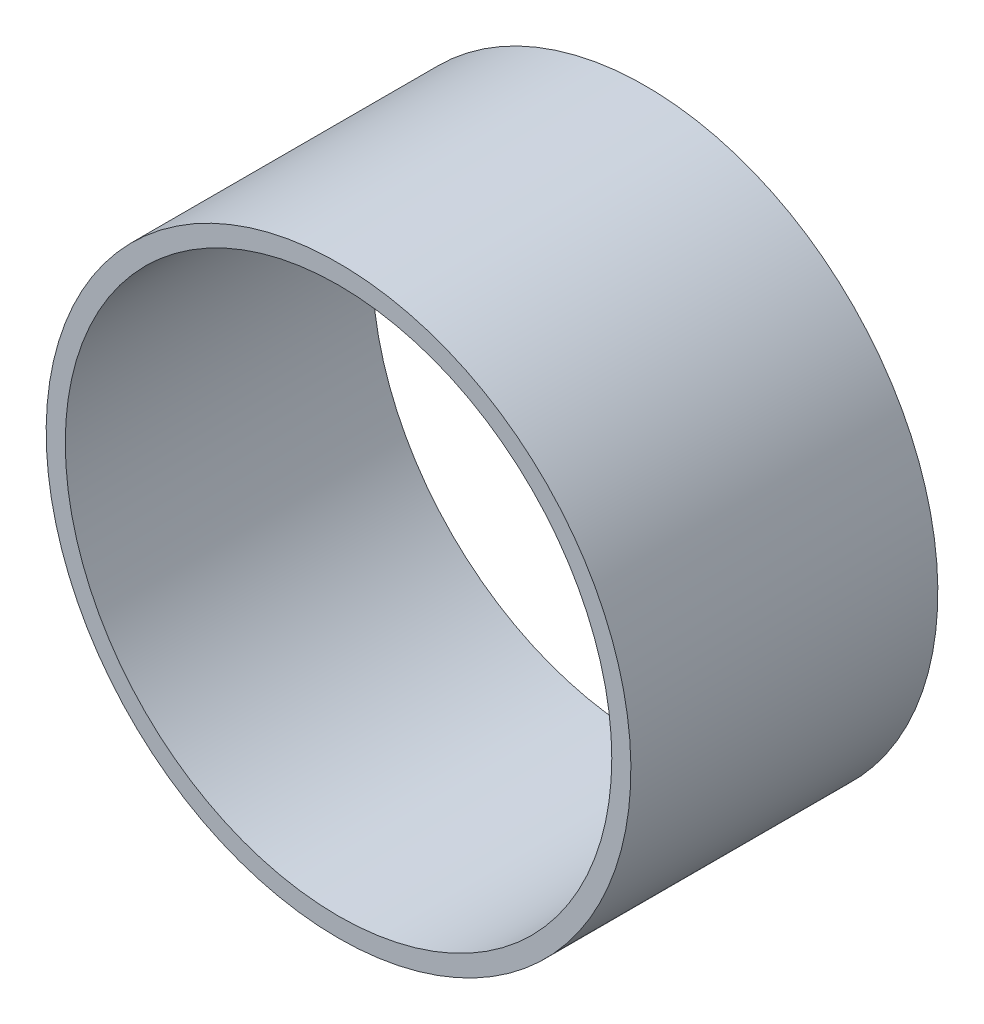
ISO-10303-21;
HEADER;
FILE_DESCRIPTION(('STEP AP214'),'2;1');
FILE_NAME('part.step','',(''),(''),'','','');
FILE_SCHEMA(('AUTOMOTIVE_DESIGN { 1 0 10303 214 1 1 1 1 }'));
ENDSEC;
DATA;
#1=APPLICATION_CONTEXT('core data for automotive mechanical design processes');
#2=APPLICATION_PROTOCOL_DEFINITION('international standard','automotive_design',2000,#1);
#3=PRODUCT_CONTEXT('',#1,'mechanical');
#4=PRODUCT('Part','Part','',(#3));
#5=PRODUCT_RELATED_PRODUCT_CATEGORY('part','',(#4));
#6=PRODUCT_DEFINITION_FORMATION('','',#4);
#7=PRODUCT_DEFINITION_CONTEXT('part definition',#1,'design');
#8=PRODUCT_DEFINITION('design','',#6,#7);
#9=PRODUCT_DEFINITION_SHAPE('','',#8);
#10=(LENGTH_UNIT() NAMED_UNIT(*) SI_UNIT(.MILLI.,.METRE.));
#11=(NAMED_UNIT(*) PLANE_ANGLE_UNIT() SI_UNIT($,.RADIAN.));
#12=(NAMED_UNIT(*) SI_UNIT($,.STERADIAN.) SOLID_ANGLE_UNIT());
#13=UNCERTAINTY_MEASURE_WITH_UNIT(LENGTH_MEASURE(1.E-05),#10,'distance_accuracy_value','');
#14=(GEOMETRIC_REPRESENTATION_CONTEXT(3) GLOBAL_UNCERTAINTY_ASSIGNED_CONTEXT((#13)) GLOBAL_UNIT_ASSIGNED_CONTEXT((#10,
#11,#12)) REPRESENTATION_CONTEXT('',''));
#15=CARTESIAN_POINT('',(0.,0.,0.));
#16=DIRECTION('',(0.,0.,1.));
#17=DIRECTION('',(1.,0.,0.));
#18=AXIS2_PLACEMENT_3D('',#15,#16,#17);
#19=CARTESIAN_POINT('',(19.812,143.812,-93.35));
#20=DIRECTION('',(0.,0.,1.));
#21=DIRECTION('',(-1.,0.,0.));
#22=AXIS2_PLACEMENT_3D('',#19,#20,#21);
#23=PLANE('',#22);
#24=CARTESIAN_POINT('',(0.,124.,-93.3500000000006));
#25=DIRECTION('',(0.,0.,1.));
#26=DIRECTION('',(0.,-1.,0.));
#27=AXIS2_PLACEMENT_3D('',#24,#25,#26);
#28=CIRCLE('',#27,17.805);
#29=CARTESIAN_POINT('',(0.,106.195,-93.3500000000006));
#30=VERTEX_POINT('',#29);
#31=EDGE_CURVE('E27',#30,#30,#28,.T.);
#32=ORIENTED_EDGE('',*,*,#31,.F.);
#33=EDGE_LOOP('',(#32));
#34=FACE_BOUND('',#33,.T.);
#35=CARTESIAN_POINT('',(0.,124.,-93.3500000000006));
#36=DIRECTION('',(0.,0.,1.));
#37=DIRECTION('',(0.,-1.,0.));
#38=AXIS2_PLACEMENT_3D('',#35,#36,#37);
#39=CIRCLE('',#38,19.05);
#40=CARTESIAN_POINT('',(0.,104.95,-93.3500000000006));
#41=VERTEX_POINT('',#40);
#42=EDGE_CURVE('E18',#41,#41,#39,.T.);
#43=ORIENTED_EDGE('',*,*,#42,.T.);
#44=EDGE_LOOP('',(#43));
#45=FACE_BOUND('',#44,.T.);
#46=ADVANCED_FACE('F14',(#34,#45),#23,.T.);
#47=CARTESIAN_POINT('',(0.,124.,-113.35));
#48=DIRECTION('',(0.,0.,1.));
#49=DIRECTION('',(0.,-1.,0.));
#50=AXIS2_PLACEMENT_3D('',#47,#48,#49);
#51=CYLINDRICAL_SURFACE('',#50,19.05);
#52=ORIENTED_EDGE('',*,*,#42,.F.);
#53=EDGE_LOOP('',(#52));
#54=FACE_BOUND('',#53,.T.);
#55=CARTESIAN_POINT('',(0.,124.,-113.35));
#56=DIRECTION('',(0.,0.,1.));
#57=DIRECTION('',(0.,-1.,0.));
#58=AXIS2_PLACEMENT_3D('',#55,#56,#57);
#59=CIRCLE('',#58,19.05);
#60=CARTESIAN_POINT('',(0.,104.95,-113.35));
#61=VERTEX_POINT('',#60);
#62=EDGE_CURVE('E22',#61,#61,#59,.T.);
#63=ORIENTED_EDGE('',*,*,#62,.T.);
#64=EDGE_LOOP('',(#63));
#65=FACE_BOUND('',#64,.T.);
#66=ADVANCED_FACE('F36',(#54,#65),#51,.T.);
#67=CARTESIAN_POINT('',(0.,124.,-113.35));
#68=DIRECTION('',(0.,0.,1.));
#69=DIRECTION('',(0.,-1.,0.));
#70=AXIS2_PLACEMENT_3D('',#67,#68,#69);
#71=CYLINDRICAL_SURFACE('',#70,17.805);
#72=ORIENTED_EDGE('',*,*,#31,.T.);
#73=EDGE_LOOP('',(#72));
#74=FACE_BOUND('',#73,.T.);
#75=CARTESIAN_POINT('',(0.,124.,-113.35));
#76=DIRECTION('',(0.,0.,1.));
#77=DIRECTION('',(0.,-1.,0.));
#78=AXIS2_PLACEMENT_3D('',#75,#76,#77);
#79=CIRCLE('',#78,17.805);
#80=CARTESIAN_POINT('',(0.,106.195,-113.35));
#81=VERTEX_POINT('',#80);
#82=EDGE_CURVE('E10',#81,#81,#79,.F.);
#83=ORIENTED_EDGE('',*,*,#82,.T.);
#84=EDGE_LOOP('',(#83));
#85=FACE_BOUND('',#84,.T.);
#86=ADVANCED_FACE('F39',(#74,#85),#71,.F.);
#87=CARTESIAN_POINT('',(19.812,143.812,-113.35));
#88=DIRECTION('',(0.,0.,1.));
#89=DIRECTION('',(-1.,0.,0.));
#90=AXIS2_PLACEMENT_3D('',#87,#88,#89);
#91=PLANE('',#90);
#92=ORIENTED_EDGE('',*,*,#82,.F.);
#93=EDGE_LOOP('',(#92));
#94=FACE_BOUND('',#93,.T.);
#95=ORIENTED_EDGE('',*,*,#62,.F.);
#96=EDGE_LOOP('',(#95));
#97=FACE_BOUND('',#96,.T.);
#98=ADVANCED_FACE('F16',(#94,#97),#91,.F.);
#99=CLOSED_SHELL('',(#46,#66,#86,#98));
#100=MANIFOLD_SOLID_BREP('B1',#99);
#101=ADVANCED_BREP_SHAPE_REPRESENTATION('',(#18,#100),#14);
#102=SHAPE_DEFINITION_REPRESENTATION(#9,#101);
ENDSEC;
END-ISO-10303-21;
